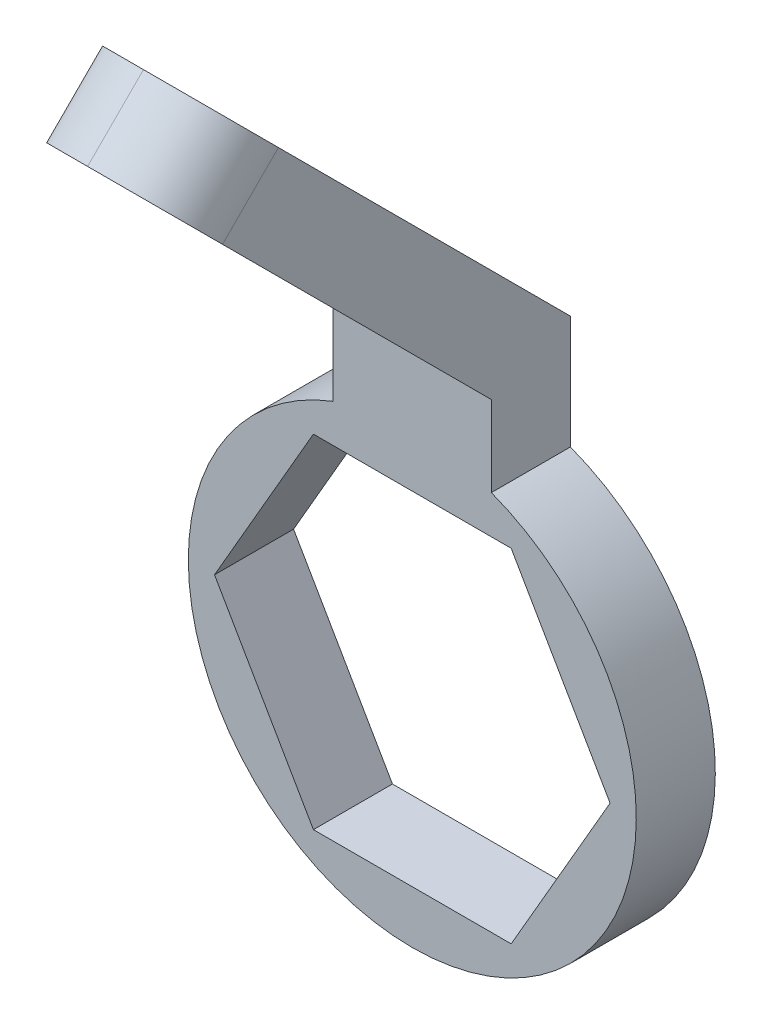
ISO-10303-21;
HEADER;
FILE_DESCRIPTION(('STEP AP214'),'2;1');
FILE_NAME('part.step','',(''),(''),'','','');
FILE_SCHEMA(('AUTOMOTIVE_DESIGN { 1 0 10303 214 1 1 1 1 }'));
ENDSEC;
DATA;
#1=APPLICATION_CONTEXT('core data for automotive mechanical design processes');
#2=APPLICATION_PROTOCOL_DEFINITION('international standard','automotive_design',2000,#1);
#3=PRODUCT_CONTEXT('',#1,'mechanical');
#4=PRODUCT('Part','Part','',(#3));
#5=PRODUCT_RELATED_PRODUCT_CATEGORY('part','',(#4));
#6=PRODUCT_DEFINITION_FORMATION('','',#4);
#7=PRODUCT_DEFINITION_CONTEXT('part definition',#1,'design');
#8=PRODUCT_DEFINITION('design','',#6,#7);
#9=PRODUCT_DEFINITION_SHAPE('','',#8);
#10=(LENGTH_UNIT() NAMED_UNIT(*) SI_UNIT(.MILLI.,.METRE.));
#11=(NAMED_UNIT(*) PLANE_ANGLE_UNIT() SI_UNIT($,.RADIAN.));
#12=(NAMED_UNIT(*) SI_UNIT($,.STERADIAN.) SOLID_ANGLE_UNIT());
#13=UNCERTAINTY_MEASURE_WITH_UNIT(LENGTH_MEASURE(1.E-05),#10,'distance_accuracy_value','');
#14=(GEOMETRIC_REPRESENTATION_CONTEXT(3) GLOBAL_UNCERTAINTY_ASSIGNED_CONTEXT((#13)) GLOBAL_UNIT_ASSIGNED_CONTEXT((#10,
#11,#12)) REPRESENTATION_CONTEXT('',''));
#15=CARTESIAN_POINT('',(0.,0.,0.));
#16=DIRECTION('',(0.,0.,1.));
#17=DIRECTION('',(1.,0.,0.));
#18=AXIS2_PLACEMENT_3D('',#15,#16,#17);
#19=CARTESIAN_POINT('',(1.49443019282357E-09,28.9147344216042,2.7533365004298));
#20=DIRECTION('',(0.,1.,0.));
#21=DIRECTION('',(0.,0.,1.));
#22=AXIS2_PLACEMENT_3D('',#19,#20,#21);
#23=PLANE('',#22);
#24=DIRECTION('',(0.,0.,-1.));
#25=VECTOR('',#24,1.);
#26=CARTESIAN_POINT('',(-11.9999999985056,28.9147344216042,2.7533365004298));
#27=LINE('',#26,#25);
#28=CARTESIAN_POINT('',(-11.9999999985056,28.9147344216042,-9.20185125223119));
#29=VERTEX_POINT('',#28);
#30=CARTESIAN_POINT('',(-11.9999999985056,28.9147344216042,-9.2466634995702));
#31=VERTEX_POINT('',#30);
#32=EDGE_CURVE('E221',#29,#31,#27,.T.);
#33=ORIENTED_EDGE('',*,*,#32,.F.);
#34=DIRECTION('',(1.,0.,0.));
#35=VECTOR('',#34,1.);
#36=CARTESIAN_POINT('',(1.49442801594342E-09,28.9147344216042,-9.20185125223118));
#37=LINE('',#36,#35);
#38=CARTESIAN_POINT('',(12.0000000014944,28.9147344216042,-9.20185125223117));
#39=VERTEX_POINT('',#38);
#40=EDGE_CURVE('E193',#29,#39,#37,.T.);
#41=ORIENTED_EDGE('',*,*,#40,.T.);
#42=DIRECTION('',(0.,0.,-1.));
#43=VECTOR('',#42,1.);
#44=CARTESIAN_POINT('',(12.0000000014944,28.9147344216042,2.7533365004298));
#45=LINE('',#44,#43);
#46=CARTESIAN_POINT('',(12.0000000014944,28.9147344216042,-9.2466634995702));
#47=VERTEX_POINT('',#46);
#48=EDGE_CURVE('E224',#39,#47,#45,.T.);
#49=ORIENTED_EDGE('',*,*,#48,.T.);
#50=DIRECTION('',(1.,0.,0.));
#51=VECTOR('',#50,1.);
#52=CARTESIAN_POINT('',(1.49443019282357E-09,28.9147344216042,-9.2466634995702));
#53=LINE('',#52,#51);
#54=EDGE_CURVE('E214',#31,#47,#53,.T.);
#55=ORIENTED_EDGE('',*,*,#54,.F.);
#56=EDGE_LOOP('',(#33,#41,#49,#55));
#57=FACE_BOUND('',#56,.T.);
#58=ADVANCED_FACE('F47',(#57),#23,.T.);
#59=CARTESIAN_POINT('',(1.49443019282357E-09,-20.0852655783958,2.7533365004298));
#60=DIRECTION('',(0.,0.,-1.));
#61=DIRECTION('',(-1.,0.,0.));
#62=AXIS2_PLACEMENT_3D('',#59,#60,#61);
#63=CYLINDRICAL_SURFACE('',#62,34.);
#64=CARTESIAN_POINT('',(1.49443019282357E-09,-20.0852655783958,-9.2466634995702));
#65=DIRECTION('',(0.,0.,1.));
#66=DIRECTION('',(1.,0.,0.));
#67=AXIS2_PLACEMENT_3D('',#64,#65,#66);
#68=CIRCLE('',#67,34.);
#69=CARTESIAN_POINT('',(-11.9999999985056,11.7266818627779,-9.2466634995702));
#70=VERTEX_POINT('',#69);
#71=CARTESIAN_POINT('',(12.0000000014944,11.7266818627779,-9.2466634995702));
#72=VERTEX_POINT('',#71);
#73=EDGE_CURVE('E208',#70,#72,#68,.T.);
#74=ORIENTED_EDGE('',*,*,#73,.T.);
#75=DIRECTION('',(0.,0.,-1.));
#76=VECTOR('',#75,1.);
#77=CARTESIAN_POINT('',(12.0000000014944,11.7266818627779,2.7533365004298));
#78=LINE('',#77,#76);
#79=CARTESIAN_POINT('',(12.0000000014944,11.7266818627779,2.7533365004298));
#80=VERTEX_POINT('',#79);
#81=EDGE_CURVE('E226',#80,#72,#78,.T.);
#82=ORIENTED_EDGE('',*,*,#81,.F.);
#83=CARTESIAN_POINT('',(1.49443019282357E-09,-20.0852655783958,2.7533365004298));
#84=DIRECTION('',(0.,0.,1.));
#85=DIRECTION('',(1.,0.,0.));
#86=AXIS2_PLACEMENT_3D('',#83,#84,#85);
#87=CIRCLE('',#86,34.);
#88=CARTESIAN_POINT('',(-11.9999999985056,11.7266818627779,2.7533365004298));
#89=VERTEX_POINT('',#88);
#90=EDGE_CURVE('E185',#89,#80,#87,.T.);
#91=ORIENTED_EDGE('',*,*,#90,.F.);
#92=DIRECTION('',(0.,0.,-1.));
#93=VECTOR('',#92,1.);
#94=CARTESIAN_POINT('',(-11.9999999985056,11.7266818627779,2.7533365004298));
#95=LINE('',#94,#93);
#96=EDGE_CURVE('E179',#89,#70,#95,.T.);
#97=ORIENTED_EDGE('',*,*,#96,.T.);
#98=EDGE_LOOP('',(#74,#82,#91,#97));
#99=FACE_BOUND('',#98,.T.);
#100=ADVANCED_FACE('F289',(#99),#63,.T.);
#101=CARTESIAN_POINT('',(12.0000000014944,-20.0852655783958,2.7533365004298));
#102=DIRECTION('',(1.,0.,0.));
#103=DIRECTION('',(0.,1.,0.));
#104=AXIS2_PLACEMENT_3D('',#101,#102,#103);
#105=PLANE('',#104);
#106=DIRECTION('',(0.,0.707106781186548,0.707106781186548));
#107=VECTOR('',#106,1.);
#108=CARTESIAN_POINT('',(12.0000000014944,28.9332962616615,-9.2466634995702));
#109=LINE('',#108,#107);
#110=CARTESIAN_POINT('',(12.0000000014944,28.9332962616615,-9.2466634995702));
#111=VERTEX_POINT('',#110);
#112=CARTESIAN_POINT('',(12.0000000014944,73.2526294243956,35.0726696631638));
#113=VERTEX_POINT('',#112);
#114=EDGE_CURVE('E165',#111,#113,#109,.T.);
#115=ORIENTED_EDGE('',*,*,#114,.T.);
#116=DIRECTION('',(0.,-0.707106781186549,0.707106781186546));
#117=VECTOR('',#116,1.);
#118=CARTESIAN_POINT('',(12.0000000014944,42.7433485043666,65.5819505831926));
#119=LINE('',#118,#117);
#120=CARTESIAN_POINT('',(12.0000000014944,64.767348050157,43.5579510374024));
#121=VERTEX_POINT('',#120);
#122=EDGE_CURVE('E227',#113,#121,#119,.T.);
#123=ORIENTED_EDGE('',*,*,#122,.T.);
#124=DIRECTION('',(0.,-0.707106781186547,-0.707106781186548));
#125=VECTOR('',#124,1.);
#126=CARTESIAN_POINT('',(12.0000000014944,73.2526294243955,52.043232411641));
#127=LINE('',#126,#125);
#128=CARTESIAN_POINT('',(12.0000000014944,23.9627336174925,2.7533365004298));
#129=VERTEX_POINT('',#128);
#130=EDGE_CURVE('E246',#121,#129,#127,.T.);
#131=ORIENTED_EDGE('',*,*,#130,.T.);
#132=DIRECTION('',(0.,-1.,0.));
#133=VECTOR('',#132,1.);
#134=CARTESIAN_POINT('',(12.0000000014944,-20.0852655783958,2.7533365004298));
#135=LINE('',#134,#133);
#136=EDGE_CURVE('E173',#129,#80,#135,.T.);
#137=ORIENTED_EDGE('',*,*,#136,.T.);
#138=ORIENTED_EDGE('',*,*,#81,.T.);
#139=DIRECTION('',(0.,-1.,0.));
#140=VECTOR('',#139,1.);
#141=CARTESIAN_POINT('',(12.0000000014944,-20.0852655783958,-9.2466634995702));
#142=LINE('',#141,#140);
#143=EDGE_CURVE('E211',#47,#72,#142,.T.);
#144=ORIENTED_EDGE('',*,*,#143,.F.);
#145=ORIENTED_EDGE('',*,*,#48,.F.);
#146=DIRECTION('',(0.,-0.382683422671202,0.923879536526626));
#147=VECTOR('',#146,1.);
#148=CARTESIAN_POINT('',(12.0000000014944,28.9332962616615,-9.2466634995702));
#149=LINE('',#148,#147);
#150=EDGE_CURVE('E264',#111,#39,#149,.T.);
#151=ORIENTED_EDGE('',*,*,#150,.F.);
#152=EDGE_LOOP('',(#115,#123,#131,#137,#138,#144,#145,#151));
#153=FACE_BOUND('',#152,.T.);
#154=ADVANCED_FACE('F293',(#153),#105,.T.);
#155=CARTESIAN_POINT('',(1.49443019282357E-09,5.91473442160417,2.7533365004298));
#156=DIRECTION('',(0.,-1.,0.));
#157=DIRECTION('',(0.,0.,-1.));
#158=AXIS2_PLACEMENT_3D('',#155,#156,#157);
#159=PLANE('',#158);
#160=DIRECTION('',(-1.,0.,0.));
#161=VECTOR('',#160,1.);
#162=CARTESIAN_POINT('',(1.49443019282357E-09,5.91473442160417,-9.2466634995702));
#163=LINE('',#162,#161);
#164=CARTESIAN_POINT('',(15.0111070004247,5.91473442160417,-9.2466634995702));
#165=VERTEX_POINT('',#164);
#166=CARTESIAN_POINT('',(-15.0111069974358,5.91473442160417,-9.2466634995702));
#167=VERTEX_POINT('',#166);
#168=EDGE_CURVE('E189',#165,#167,#163,.T.);
#169=ORIENTED_EDGE('',*,*,#168,.F.);
#170=DIRECTION('',(0.,0.,-1.));
#171=VECTOR('',#170,1.);
#172=CARTESIAN_POINT('',(15.0111070004247,5.91473442160417,2.7533365004298));
#173=LINE('',#172,#171);
#174=CARTESIAN_POINT('',(15.0111070004247,5.91473442160417,2.7533365004298));
#175=VERTEX_POINT('',#174);
#176=EDGE_CURVE('E222',#175,#165,#173,.T.);
#177=ORIENTED_EDGE('',*,*,#176,.F.);
#178=DIRECTION('',(-1.,0.,0.));
#179=VECTOR('',#178,1.);
#180=CARTESIAN_POINT('',(1.49443019282357E-09,5.91473442160417,2.7533365004298));
#181=LINE('',#180,#179);
#182=CARTESIAN_POINT('',(-15.0111069974358,5.91473442160417,2.7533365004298));
#183=VERTEX_POINT('',#182);
#184=EDGE_CURVE('E219',#175,#183,#181,.T.);
#185=ORIENTED_EDGE('',*,*,#184,.T.);
#186=DIRECTION('',(0.,0.,-1.));
#187=VECTOR('',#186,1.);
#188=CARTESIAN_POINT('',(-15.0111069974358,5.91473442160417,2.7533365004298));
#189=LINE('',#188,#187);
#190=EDGE_CURVE('E181',#183,#167,#189,.T.);
#191=ORIENTED_EDGE('',*,*,#190,.T.);
#192=EDGE_LOOP('',(#169,#177,#185,#191));
#193=FACE_BOUND('',#192,.T.);
#194=ADVANCED_FACE('F331',(#193),#159,.T.);
#195=CARTESIAN_POINT('',(22.5166604998898,-7.08526557839584,2.7533365004298));
#196=DIRECTION('',(-0.866025403784439,-0.5,0.));
#197=DIRECTION('',(0.5,-0.866025403784439,0.));
#198=AXIS2_PLACEMENT_3D('',#195,#196,#197);
#199=PLANE('',#198);
#200=DIRECTION('',(-0.5,0.866025403784439,0.));
#201=VECTOR('',#200,1.);
#202=CARTESIAN_POINT('',(22.5166604998898,-7.08526557839584,-9.2466634995702));
#203=LINE('',#202,#201);
#204=CARTESIAN_POINT('',(30.022213999355,-20.0852655783958,-9.2466634995702));
#205=VERTEX_POINT('',#204);
#206=EDGE_CURVE('E192',#205,#165,#203,.T.);
#207=ORIENTED_EDGE('',*,*,#206,.F.);
#208=DIRECTION('',(0.,0.,-1.));
#209=VECTOR('',#208,1.);
#210=CARTESIAN_POINT('',(30.022213999355,-20.0852655783958,2.7533365004298));
#211=LINE('',#210,#209);
#212=CARTESIAN_POINT('',(30.022213999355,-20.0852655783958,2.7533365004298));
#213=VERTEX_POINT('',#212);
#214=EDGE_CURVE('E234',#213,#205,#211,.T.);
#215=ORIENTED_EDGE('',*,*,#214,.F.);
#216=DIRECTION('',(-0.5,0.866025403784439,0.));
#217=VECTOR('',#216,1.);
#218=CARTESIAN_POINT('',(22.5166604998898,-7.08526557839584,2.7533365004298));
#219=LINE('',#218,#217);
#220=EDGE_CURVE('E273',#213,#175,#219,.T.);
#221=ORIENTED_EDGE('',*,*,#220,.T.);
#222=ORIENTED_EDGE('',*,*,#176,.T.);
#223=EDGE_LOOP('',(#207,#215,#221,#222));
#224=FACE_BOUND('',#223,.T.);
#225=ADVANCED_FACE('F348',(#224),#199,.T.);
#226=CARTESIAN_POINT('',(22.5166604998898,-33.0852655783958,2.7533365004298));
#227=DIRECTION('',(-0.866025403784438,0.5,0.));
#228=DIRECTION('',(-0.5,-0.866025403784439,0.));
#229=AXIS2_PLACEMENT_3D('',#226,#227,#228);
#230=PLANE('',#229);
#231=DIRECTION('',(0.5,0.866025403784439,0.));
#232=VECTOR('',#231,1.);
#233=CARTESIAN_POINT('',(22.5166604998898,-33.0852655783958,-9.2466634995702));
#234=LINE('',#233,#232);
#235=CARTESIAN_POINT('',(15.0111070004247,-46.0852655783958,-9.2466634995702));
#236=VERTEX_POINT('',#235);
#237=EDGE_CURVE('E196',#236,#205,#234,.T.);
#238=ORIENTED_EDGE('',*,*,#237,.F.);
#239=DIRECTION('',(0.,0.,-1.));
#240=VECTOR('',#239,1.);
#241=CARTESIAN_POINT('',(15.0111070004247,-46.0852655783958,2.7533365004298));
#242=LINE('',#241,#240);
#243=CARTESIAN_POINT('',(15.0111070004247,-46.0852655783958,2.7533365004298));
#244=VERTEX_POINT('',#243);
#245=EDGE_CURVE('E232',#244,#236,#242,.T.);
#246=ORIENTED_EDGE('',*,*,#245,.F.);
#247=DIRECTION('',(0.5,0.866025403784439,0.));
#248=VECTOR('',#247,1.);
#249=CARTESIAN_POINT('',(22.5166604998898,-33.0852655783958,2.7533365004298));
#250=LINE('',#249,#248);
#251=EDGE_CURVE('E276',#244,#213,#250,.T.);
#252=ORIENTED_EDGE('',*,*,#251,.T.);
#253=ORIENTED_EDGE('',*,*,#214,.T.);
#254=EDGE_LOOP('',(#238,#246,#252,#253));
#255=FACE_BOUND('',#254,.T.);
#256=ADVANCED_FACE('F344',(#255),#230,.T.);
#257=CARTESIAN_POINT('',(1.49442718819437E-09,-46.0852655783958,2.7533365004298));
#258=DIRECTION('',(0.,1.,0.));
#259=DIRECTION('',(-1.,0.,0.));
#260=AXIS2_PLACEMENT_3D('',#257,#258,#259);
#261=PLANE('',#260);
#262=DIRECTION('',(1.,0.,0.));
#263=VECTOR('',#262,1.);
#264=CARTESIAN_POINT('',(1.49442718819437E-09,-46.0852655783958,-9.2466634995702));
#265=LINE('',#264,#263);
#266=CARTESIAN_POINT('',(-15.0111069974359,-46.0852655783958,-9.2466634995702));
#267=VERTEX_POINT('',#266);
#268=EDGE_CURVE('E199',#267,#236,#265,.T.);
#269=ORIENTED_EDGE('',*,*,#268,.F.);
#270=DIRECTION('',(0.,0.,-1.));
#271=VECTOR('',#270,1.);
#272=CARTESIAN_POINT('',(-15.0111069974359,-46.0852655783958,2.7533365004298));
#273=LINE('',#272,#271);
#274=CARTESIAN_POINT('',(-15.0111069974359,-46.0852655783958,2.7533365004298));
#275=VERTEX_POINT('',#274);
#276=EDGE_CURVE('E230',#275,#267,#273,.T.);
#277=ORIENTED_EDGE('',*,*,#276,.F.);
#278=DIRECTION('',(1.,0.,0.));
#279=VECTOR('',#278,1.);
#280=CARTESIAN_POINT('',(1.49442718819437E-09,-46.0852655783958,2.7533365004298));
#281=LINE('',#280,#279);
#282=EDGE_CURVE('E279',#275,#244,#281,.T.);
#283=ORIENTED_EDGE('',*,*,#282,.T.);
#284=ORIENTED_EDGE('',*,*,#245,.T.);
#285=EDGE_LOOP('',(#269,#277,#283,#284));
#286=FACE_BOUND('',#285,.T.);
#287=ADVANCED_FACE('F340',(#286),#261,.T.);
#288=CARTESIAN_POINT('',(-22.516660496901,-33.0852655783958,2.7533365004298));
#289=DIRECTION('',(0.866025403784439,0.5,0.));
#290=DIRECTION('',(-0.5,0.866025403784439,0.));
#291=AXIS2_PLACEMENT_3D('',#288,#289,#290);
#292=PLANE('',#291);
#293=DIRECTION('',(0.5,-0.866025403784439,0.));
#294=VECTOR('',#293,1.);
#295=CARTESIAN_POINT('',(-22.516660496901,-33.0852655783958,-9.2466634995702));
#296=LINE('',#295,#294);
#297=CARTESIAN_POINT('',(-30.0222139963661,-20.0852655783958,-9.2466634995702));
#298=VERTEX_POINT('',#297);
#299=EDGE_CURVE('E202',#298,#267,#296,.T.);
#300=ORIENTED_EDGE('',*,*,#299,.F.);
#301=DIRECTION('',(0.,0.,-1.));
#302=VECTOR('',#301,1.);
#303=CARTESIAN_POINT('',(-30.0222139963661,-20.0852655783958,2.7533365004298));
#304=LINE('',#303,#302);
#305=CARTESIAN_POINT('',(-30.0222139963661,-20.0852655783958,2.7533365004298));
#306=VERTEX_POINT('',#305);
#307=EDGE_CURVE('E183',#306,#298,#304,.T.);
#308=ORIENTED_EDGE('',*,*,#307,.F.);
#309=DIRECTION('',(0.5,-0.866025403784439,0.));
#310=VECTOR('',#309,1.);
#311=CARTESIAN_POINT('',(-22.516660496901,-33.0852655783958,2.7533365004298));
#312=LINE('',#311,#310);
#313=EDGE_CURVE('E282',#306,#275,#312,.T.);
#314=ORIENTED_EDGE('',*,*,#313,.T.);
#315=ORIENTED_EDGE('',*,*,#276,.T.);
#316=EDGE_LOOP('',(#300,#308,#314,#315));
#317=FACE_BOUND('',#316,.T.);
#318=ADVANCED_FACE('F336',(#317),#292,.T.);
#319=CARTESIAN_POINT('',(-22.516660496901,-7.08526557839584,2.7533365004298));
#320=DIRECTION('',(0.866025403784439,-0.5,0.));
#321=DIRECTION('',(0.5,0.866025403784439,0.));
#322=AXIS2_PLACEMENT_3D('',#319,#320,#321);
#323=PLANE('',#322);
#324=DIRECTION('',(-0.5,-0.866025403784439,0.));
#325=VECTOR('',#324,1.);
#326=CARTESIAN_POINT('',(-22.516660496901,-7.08526557839584,-9.2466634995702));
#327=LINE('',#326,#325);
#328=EDGE_CURVE('E205',#167,#298,#327,.T.);
#329=ORIENTED_EDGE('',*,*,#328,.F.);
#330=ORIENTED_EDGE('',*,*,#190,.F.);
#331=DIRECTION('',(-0.5,-0.866025403784439,0.));
#332=VECTOR('',#331,1.);
#333=CARTESIAN_POINT('',(-22.516660496901,-7.08526557839584,2.7533365004298));
#334=LINE('',#333,#332);
#335=EDGE_CURVE('E285',#183,#306,#334,.T.);
#336=ORIENTED_EDGE('',*,*,#335,.T.);
#337=ORIENTED_EDGE('',*,*,#307,.T.);
#338=EDGE_LOOP('',(#329,#330,#336,#337));
#339=FACE_BOUND('',#338,.T.);
#340=ADVANCED_FACE('F333',(#339),#323,.T.);
#341=CARTESIAN_POINT('',(-11.9999999985056,-20.0852655783958,2.7533365004298));
#342=DIRECTION('',(1.,0.,0.));
#343=DIRECTION('',(0.,1.,0.));
#344=AXIS2_PLACEMENT_3D('',#341,#342,#343);
#345=PLANE('',#344);
#346=DIRECTION('',(0.,-0.707106781186547,-0.707106781186548));
#347=VECTOR('',#346,1.);
#348=CARTESIAN_POINT('',(-11.9999999985056,73.2526294243955,52.043232411641));
#349=LINE('',#348,#347);
#350=CARTESIAN_POINT('',(-11.9999999985056,64.767348050157,43.5579510374024));
#351=VERTEX_POINT('',#350);
#352=CARTESIAN_POINT('',(-11.9999999985056,23.9627336174925,2.75333660473793));
#353=VERTEX_POINT('',#352);
#354=EDGE_CURVE('E155',#351,#353,#349,.T.);
#355=ORIENTED_EDGE('',*,*,#354,.F.);
#356=DIRECTION('',(0.,-0.707106781186549,0.707106781186546));
#357=VECTOR('',#356,1.);
#358=CARTESIAN_POINT('',(-11.9999999985056,73.2526294243956,35.0726696631638));
#359=LINE('',#358,#357);
#360=CARTESIAN_POINT('',(-11.9999999985056,73.2526294243956,35.0726696631638));
#361=VERTEX_POINT('',#360);
#362=EDGE_CURVE('E11',#351,#361,#359,.F.);
#363=ORIENTED_EDGE('',*,*,#362,.T.);
#364=DIRECTION('',(0.,0.707106781186548,0.707106781186548));
#365=VECTOR('',#364,1.);
#366=CARTESIAN_POINT('',(-11.9999999985056,28.9332962616615,-9.2466634995702));
#367=LINE('',#366,#365);
#368=CARTESIAN_POINT('',(-11.9999999985056,28.9332962616615,-9.2466634995702));
#369=VERTEX_POINT('',#368);
#370=EDGE_CURVE('E175',#369,#361,#367,.T.);
#371=ORIENTED_EDGE('',*,*,#370,.F.);
#372=DIRECTION('',(0.,-0.382683422671202,0.923879536526626));
#373=VECTOR('',#372,1.);
#374=CARTESIAN_POINT('',(-11.9999999985056,28.9332962616615,-9.2466634995702));
#375=LINE('',#374,#373);
#376=EDGE_CURVE('E164',#369,#29,#375,.T.);
#377=ORIENTED_EDGE('',*,*,#376,.T.);
#378=ORIENTED_EDGE('',*,*,#32,.T.);
#379=DIRECTION('',(0.,-1.,0.));
#380=VECTOR('',#379,1.);
#381=CARTESIAN_POINT('',(-11.9999999985056,-20.0852655783958,-9.2466634995702));
#382=LINE('',#381,#380);
#383=EDGE_CURVE('E217',#31,#70,#382,.T.);
#384=ORIENTED_EDGE('',*,*,#383,.T.);
#385=ORIENTED_EDGE('',*,*,#96,.F.);
#386=DIRECTION('',(0.,-1.,0.));
#387=VECTOR('',#386,1.);
#388=CARTESIAN_POINT('',(-11.9999999985056,-20.0852655783958,2.7533365004298));
#389=LINE('',#388,#387);
#390=EDGE_CURVE('E171',#353,#89,#389,.T.);
#391=ORIENTED_EDGE('',*,*,#390,.F.);
#392=EDGE_LOOP('',(#355,#363,#371,#377,#378,#384,#385,#391));
#393=FACE_BOUND('',#392,.T.);
#394=ADVANCED_FACE('F177',(#393),#345,.F.);
#395=CARTESIAN_POINT('',(1.49443019282357E-09,-20.0852655783958,2.7533365004298));
#396=DIRECTION('',(0.,0.,1.));
#397=DIRECTION('',(1.,0.,0.));
#398=AXIS2_PLACEMENT_3D('',#395,#396,#397);
#399=PLANE('',#398);
#400=DIRECTION('',(1.,0.,0.));
#401=VECTOR('',#400,1.);
#402=CARTESIAN_POINT('',(-11.9999999985056,23.9627336174925,2.75333660473793));
#403=LINE('',#402,#401);
#404=EDGE_CURVE('E159',#353,#129,#403,.T.);
#405=ORIENTED_EDGE('',*,*,#404,.F.);
#406=ORIENTED_EDGE('',*,*,#390,.T.);
#407=ORIENTED_EDGE('',*,*,#90,.T.);
#408=ORIENTED_EDGE('',*,*,#136,.F.);
#409=EDGE_LOOP('',(#405,#406,#407,#408));
#410=FACE_BOUND('',#409,.T.);
#411=ORIENTED_EDGE('',*,*,#184,.F.);
#412=ORIENTED_EDGE('',*,*,#220,.F.);
#413=ORIENTED_EDGE('',*,*,#251,.F.);
#414=ORIENTED_EDGE('',*,*,#282,.F.);
#415=ORIENTED_EDGE('',*,*,#313,.F.);
#416=ORIENTED_EDGE('',*,*,#335,.F.);
#417=EDGE_LOOP('',(#411,#412,#413,#414,#415,#416));
#418=FACE_BOUND('',#417,.T.);
#419=ADVANCED_FACE('F168',(#410,#418),#399,.T.);
#420=CARTESIAN_POINT('',(1.49443019282357E-09,-20.0852655783958,-9.2466634995702));
#421=DIRECTION('',(0.,0.,1.));
#422=DIRECTION('',(1.,0.,0.));
#423=AXIS2_PLACEMENT_3D('',#420,#421,#422);
#424=PLANE('',#423);
#425=ORIENTED_EDGE('',*,*,#168,.T.);
#426=ORIENTED_EDGE('',*,*,#328,.T.);
#427=ORIENTED_EDGE('',*,*,#299,.T.);
#428=ORIENTED_EDGE('',*,*,#268,.T.);
#429=ORIENTED_EDGE('',*,*,#237,.T.);
#430=ORIENTED_EDGE('',*,*,#206,.T.);
#431=EDGE_LOOP('',(#425,#426,#427,#428,#429,#430));
#432=FACE_BOUND('',#431,.T.);
#433=ORIENTED_EDGE('',*,*,#73,.F.);
#434=ORIENTED_EDGE('',*,*,#383,.F.);
#435=ORIENTED_EDGE('',*,*,#54,.T.);
#436=ORIENTED_EDGE('',*,*,#143,.T.);
#437=EDGE_LOOP('',(#433,#434,#435,#436));
#438=FACE_BOUND('',#437,.T.);
#439=ADVANCED_FACE('F311',(#432,#438),#424,.F.);
#440=CARTESIAN_POINT('',(-11.9999999985056,28.9332962616615,-9.2466634995702));
#441=DIRECTION('',(0.,0.707106781186547,-0.707106781186547));
#442=DIRECTION('',(0.,0.707106781186548,0.707106781186548));
#443=AXIS2_PLACEMENT_3D('',#440,#441,#442);
#444=PLANE('',#443);
#445=CARTESIAN_POINT('',(0.,70.4242022996494,32.2442425384176));
#446=DIRECTION('',(0.,0.707106781186547,-0.707106781186547));
#447=DIRECTION('',(0.,0.707106781186548,0.707106781186548));
#448=AXIS2_PLACEMENT_3D('',#445,#446,#447);
#449=CIRCLE('',#448,8.);
#450=CARTESIAN_POINT('',(0.,76.0810565491418,37.90109678791));
#451=VERTEX_POINT('',#450);
#452=EDGE_CURVE('E247',#451,#451,#449,.F.);
#453=ORIENTED_EDGE('',*,*,#452,.T.);
#454=EDGE_LOOP('',(#453));
#455=FACE_BOUND('',#454,.T.);
#456=CARTESIAN_POINT('',(1.49442672337661E-09,73.2526294243956,35.0726696631638));
#457=DIRECTION('',(0.,0.707106781186547,-0.707106781186547));
#458=DIRECTION('',(0.,0.707106781186548,0.707106781186548));
#459=AXIS2_PLACEMENT_3D('',#456,#457,#458);
#460=CIRCLE('',#459,12.);
#461=CARTESIAN_POINT('',(1.49442672337661E-09,81.7379107986341,43.5579510374024));
#462=VERTEX_POINT('',#461);
#463=EDGE_CURVE('E64',#361,#462,#460,.T.);
#464=ORIENTED_EDGE('',*,*,#463,.T.);
#465=CARTESIAN_POINT('',(1.49443376317825E-09,73.2526294243956,35.0726696631638));
#466=DIRECTION('',(0.,0.707106781186547,-0.707106781186547));
#467=DIRECTION('',(0.,0.707106781186548,0.707106781186548));
#468=AXIS2_PLACEMENT_3D('',#465,#466,#467);
#469=CIRCLE('',#468,12.);
#470=EDGE_CURVE('E56',#462,#113,#469,.T.);
#471=ORIENTED_EDGE('',*,*,#470,.T.);
#472=ORIENTED_EDGE('',*,*,#114,.F.);
#473=DIRECTION('',(1.,0.,0.));
#474=VECTOR('',#473,1.);
#475=CARTESIAN_POINT('',(-11.9999999985056,28.9332962616615,-9.2466634995702));
#476=LINE('',#475,#474);
#477=EDGE_CURVE('E174',#369,#111,#476,.T.);
#478=ORIENTED_EDGE('',*,*,#477,.F.);
#479=ORIENTED_EDGE('',*,*,#370,.T.);
#480=EDGE_LOOP('',(#464,#471,#472,#478,#479));
#481=FACE_BOUND('',#480,.T.);
#482=ADVANCED_FACE('F301',(#455,#481),#444,.T.);
#483=CARTESIAN_POINT('',(-11.9999999985056,28.9332962616615,-9.2466634995702));
#484=DIRECTION('',(0.,0.923879536526626,0.382683422671202));
#485=DIRECTION('',(0.,-0.382683422671202,0.923879536526626));
#486=AXIS2_PLACEMENT_3D('',#483,#484,#485);
#487=PLANE('',#486);
#488=ORIENTED_EDGE('',*,*,#40,.F.);
#489=ORIENTED_EDGE('',*,*,#376,.F.);
#490=ORIENTED_EDGE('',*,*,#477,.T.);
#491=ORIENTED_EDGE('',*,*,#150,.T.);
#492=EDGE_LOOP('',(#488,#489,#490,#491));
#493=FACE_BOUND('',#492,.T.);
#494=ADVANCED_FACE('F304',(#493),#487,.F.);
#495=CARTESIAN_POINT('',(-11.9999999985056,73.2526294243955,52.043232411641));
#496=DIRECTION('',(0.,-0.707106781186548,0.707106781186547));
#497=DIRECTION('',(0.,-0.707106781186547,-0.707106781186548));
#498=AXIS2_PLACEMENT_3D('',#495,#496,#497);
#499=PLANE('',#498);
#500=CARTESIAN_POINT('',(0.,61.9389209254108,40.7295239126562));
#501=DIRECTION('',(0.,-0.707106781186548,0.707106781186547));
#502=DIRECTION('',(0.,-0.707106781186547,-0.707106781186548));
#503=AXIS2_PLACEMENT_3D('',#500,#501,#502);
#504=CIRCLE('',#503,4.);
#505=CARTESIAN_POINT('',(0.,59.1104938006646,37.90109678791));
#506=VERTEX_POINT('',#505);
#507=EDGE_CURVE('E51',#506,#506,#504,.T.);
#508=ORIENTED_EDGE('',*,*,#507,.F.);
#509=EDGE_LOOP('',(#508));
#510=FACE_BOUND('',#509,.T.);
#511=ORIENTED_EDGE('',*,*,#130,.F.);
#512=CARTESIAN_POINT('',(1.49443312319491E-09,64.767348050157,43.5579510374024));
#513=DIRECTION('',(0.,-0.707106781186548,0.707106781186547));
#514=DIRECTION('',(0.,-0.707106781186547,-0.707106781186548));
#515=AXIS2_PLACEMENT_3D('',#512,#513,#514);
#516=CIRCLE('',#515,12.);
#517=CARTESIAN_POINT('',(1.49442845810009E-09,73.2526294243955,52.043232411641));
#518=VERTEX_POINT('',#517);
#519=EDGE_CURVE('E240',#121,#518,#516,.T.);
#520=ORIENTED_EDGE('',*,*,#519,.T.);
#521=CARTESIAN_POINT('',(1.49442736335995E-09,64.767348050157,43.5579510374024));
#522=DIRECTION('',(0.,-0.707106781186548,0.707106781186547));
#523=DIRECTION('',(0.,-0.707106781186547,-0.707106781186548));
#524=AXIS2_PLACEMENT_3D('',#521,#522,#523);
#525=CIRCLE('',#524,12.);
#526=EDGE_CURVE('E162',#518,#351,#525,.T.);
#527=ORIENTED_EDGE('',*,*,#526,.T.);
#528=ORIENTED_EDGE('',*,*,#354,.T.);
#529=ORIENTED_EDGE('',*,*,#404,.T.);
#530=EDGE_LOOP('',(#511,#520,#527,#528,#529));
#531=FACE_BOUND('',#530,.T.);
#532=ADVANCED_FACE('F158',(#510,#531),#499,.T.);
#533=CARTESIAN_POINT('',(1.49442672337661E-09,73.2526294243956,35.0726696631638));
#534=DIRECTION('',(0.,0.707106781186549,-0.707106781186546));
#535=DIRECTION('',(0.,0.707106781186546,0.707106781186549));
#536=AXIS2_PLACEMENT_3D('',#533,#534,#535);
#537=CYLINDRICAL_SURFACE('',#536,12.);
#538=DIRECTION('',(0.,-0.707106781186549,0.707106781186546));
#539=VECTOR('',#538,1.);
#540=CARTESIAN_POINT('',(1.49442800334329E-09,73.2526294243955,52.043232411641));
#541=LINE('',#540,#539);
#542=EDGE_CURVE('E244',#462,#518,#541,.T.);
#543=ORIENTED_EDGE('',*,*,#542,.F.);
#544=ORIENTED_EDGE('',*,*,#463,.F.);
#545=ORIENTED_EDGE('',*,*,#362,.F.);
#546=ORIENTED_EDGE('',*,*,#526,.F.);
#547=EDGE_LOOP('',(#543,#544,#545,#546));
#548=FACE_BOUND('',#547,.T.);
#549=ADVANCED_FACE('F49',(#548),#537,.T.);
#550=CARTESIAN_POINT('',(1.49443146208408E-09,42.7433485043666,65.5819505831926));
#551=DIRECTION('',(0.,-0.707106781186549,0.707106781186546));
#552=DIRECTION('',(0.,-0.707106781186546,-0.707106781186549));
#553=AXIS2_PLACEMENT_3D('',#550,#551,#552);
#554=CYLINDRICAL_SURFACE('',#553,12.);
#555=ORIENTED_EDGE('',*,*,#470,.F.);
#556=ORIENTED_EDGE('',*,*,#542,.T.);
#557=ORIENTED_EDGE('',*,*,#519,.F.);
#558=ORIENTED_EDGE('',*,*,#122,.F.);
#559=EDGE_LOOP('',(#555,#556,#557,#558));
#560=FACE_BOUND('',#559,.T.);
#561=ADVANCED_FACE('F299',(#560),#554,.T.);
#562=CARTESIAN_POINT('',(0.,96.8265095681357,5.84193526993134));
#563=DIRECTION('',(0.,-0.707106781186548,0.707106781186547));
#564=DIRECTION('',(0.,-0.707106781186547,-0.707106781186548));
#565=AXIS2_PLACEMENT_3D('',#562,#563,#564);
#566=CYLINDRICAL_SURFACE('',#565,8.);
#567=ORIENTED_EDGE('',*,*,#452,.F.);
#568=EDGE_LOOP('',(#567));
#569=FACE_BOUND('',#568,.T.);
#570=CARTESIAN_POINT('',(0.,66.7826023765386,35.8858424615284));
#571=DIRECTION('',(0.,0.707106781186548,-0.707106781186547));
#572=DIRECTION('',(0.,0.707106781186547,0.707106781186548));
#573=AXIS2_PLACEMENT_3D('',#570,#571,#572);
#574=CIRCLE('',#573,8.);
#575=CARTESIAN_POINT('',(0.,72.439456626031,41.5426967110208));
#576=VERTEX_POINT('',#575);
#577=EDGE_CURVE('E249',#576,#576,#574,.T.);
#578=ORIENTED_EDGE('',*,*,#577,.F.);
#579=EDGE_LOOP('',(#578));
#580=FACE_BOUND('',#579,.T.);
#581=ADVANCED_FACE('F356',(#569,#580),#566,.F.);
#582=CARTESIAN_POINT('',(0.,66.7826023765386,35.8858424615284));
#583=DIRECTION('',(0.,0.707106781186548,-0.707106781186547));
#584=DIRECTION('',(0.,0.707106781186547,0.707106781186548));
#585=AXIS2_PLACEMENT_3D('',#582,#583,#584);
#586=PLANE('',#585);
#587=CARTESIAN_POINT('',(0.,66.7826023765387,35.8858424615284));
#588=DIRECTION('',(0.,0.707106781186548,-0.707106781186548));
#589=DIRECTION('',(0.,0.707106781186548,0.707106781186548));
#590=AXIS2_PLACEMENT_3D('',#587,#588,#589);
#591=CIRCLE('',#590,4.);
#592=CARTESIAN_POINT('',(0.,69.6110295012848,38.7142695862746));
#593=VERTEX_POINT('',#592);
#594=EDGE_CURVE('E257',#593,#593,#591,.T.);
#595=ORIENTED_EDGE('',*,*,#594,.F.);
#596=EDGE_LOOP('',(#595));
#597=FACE_BOUND('',#596,.T.);
#598=ORIENTED_EDGE('',*,*,#577,.T.);
#599=EDGE_LOOP('',(#598));
#600=FACE_BOUND('',#599,.T.);
#601=ADVANCED_FACE('F362',(#597,#600),#586,.T.);
#602=CARTESIAN_POINT('',(0.,-1.73002657598489,104.398471414052));
#603=DIRECTION('',(0.,0.707106781186547,-0.707106781186547));
#604=DIRECTION('',(0.,0.707106781186548,0.707106781186548));
#605=AXIS2_PLACEMENT_3D('',#602,#603,#604);
#606=CYLINDRICAL_SURFACE('',#605,4.);
#607=ORIENTED_EDGE('',*,*,#507,.T.);
#608=EDGE_LOOP('',(#607));
#609=FACE_BOUND('',#608,.T.);
#610=ORIENTED_EDGE('',*,*,#594,.T.);
#611=EDGE_LOOP('',(#610));
#612=FACE_BOUND('',#611,.T.);
#613=ADVANCED_FACE('F378',(#609,#612),#606,.F.);
#614=CLOSED_SHELL('',(#58,#100,#154,#194,#225,#256,#287,#318,#340,#394,#419,#439,#482,#494,#532,
#549,#561,#581,#601,#613));
#615=MANIFOLD_SOLID_BREP('B2',#614);
#616=ADVANCED_BREP_SHAPE_REPRESENTATION('',(#18,#615),#14);
#617=SHAPE_DEFINITION_REPRESENTATION(#9,#616);
ENDSEC;
END-ISO-10303-21;
